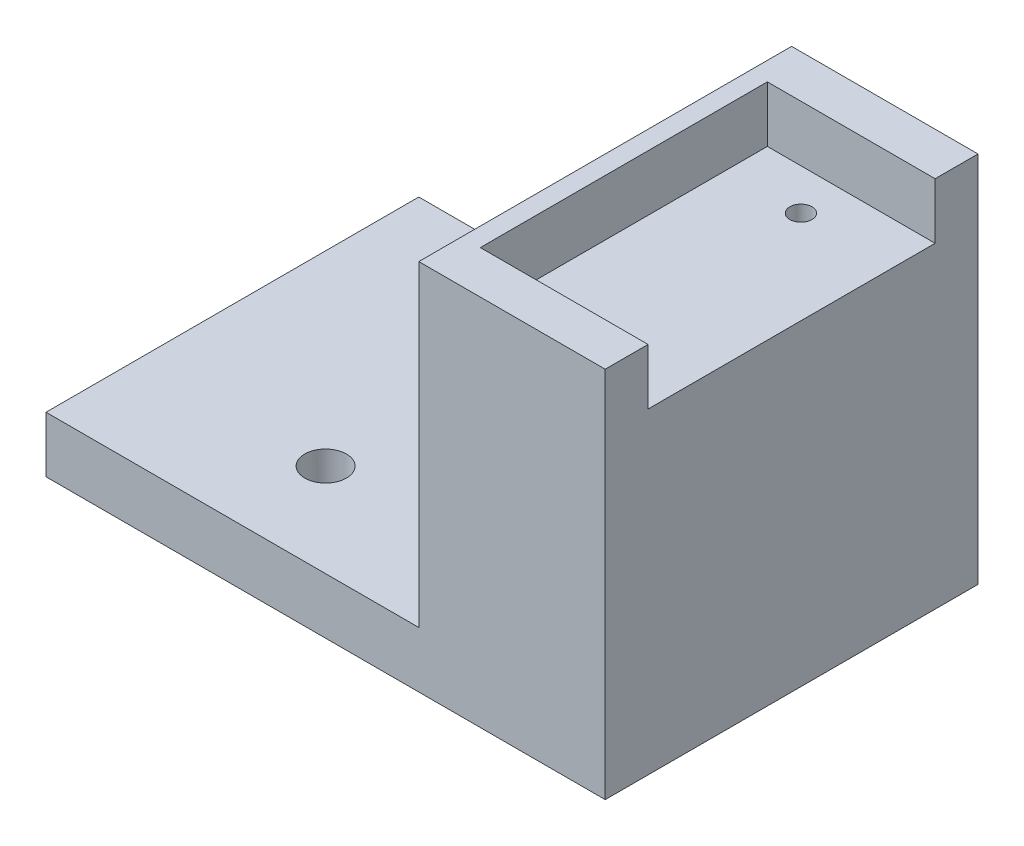
ISO-10303-21;
HEADER;
FILE_DESCRIPTION(('STEP AP214'),'2;1');
FILE_NAME('part.step','',(''),(''),'','','');
FILE_SCHEMA(('AUTOMOTIVE_DESIGN { 1 0 10303 214 1 1 1 1 }'));
ENDSEC;
DATA;
#1=APPLICATION_CONTEXT('core data for automotive mechanical design processes');
#2=APPLICATION_PROTOCOL_DEFINITION('international standard','automotive_design',2000,#1);
#3=PRODUCT_CONTEXT('',#1,'mechanical');
#4=PRODUCT('Part','Part','',(#3));
#5=PRODUCT_RELATED_PRODUCT_CATEGORY('part','',(#4));
#6=PRODUCT_DEFINITION_FORMATION('','',#4);
#7=PRODUCT_DEFINITION_CONTEXT('part definition',#1,'design');
#8=PRODUCT_DEFINITION('design','',#6,#7);
#9=PRODUCT_DEFINITION_SHAPE('','',#8);
#10=(LENGTH_UNIT() NAMED_UNIT(*) SI_UNIT(.MILLI.,.METRE.));
#11=(NAMED_UNIT(*) PLANE_ANGLE_UNIT() SI_UNIT($,.RADIAN.));
#12=(NAMED_UNIT(*) SI_UNIT($,.STERADIAN.) SOLID_ANGLE_UNIT());
#13=UNCERTAINTY_MEASURE_WITH_UNIT(LENGTH_MEASURE(1.E-05),#10,'distance_accuracy_value','');
#14=(GEOMETRIC_REPRESENTATION_CONTEXT(3) GLOBAL_UNCERTAINTY_ASSIGNED_CONTEXT((#13)) GLOBAL_UNIT_ASSIGNED_CONTEXT((#10,
#11,#12)) REPRESENTATION_CONTEXT('',''));
#15=CARTESIAN_POINT('',(0.,0.,0.));
#16=DIRECTION('',(0.,0.,1.));
#17=DIRECTION('',(1.,0.,0.));
#18=AXIS2_PLACEMENT_3D('',#15,#16,#17);
#19=CARTESIAN_POINT('',(12.7,0.,0.));
#20=DIRECTION('',(0.,1.,0.));
#21=DIRECTION('',(0.,0.,1.));
#22=AXIS2_PLACEMENT_3D('',#19,#20,#21);
#23=PLANE('',#22);
#24=CARTESIAN_POINT('',(-12.7,0.,-6.35));
#25=DIRECTION('',(0.,-1.,0.));
#26=DIRECTION('',(0.,0.,-1.));
#27=AXIS2_PLACEMENT_3D('',#24,#25,#26);
#28=CIRCLE('',#27,1.4224);
#29=CARTESIAN_POINT('',(-12.7,0.,-7.7724));
#30=VERTEX_POINT('',#29);
#31=EDGE_CURVE('E412',#30,#30,#28,.T.);
#32=ORIENTED_EDGE('',*,*,#31,.F.);
#33=EDGE_LOOP('',(#32));
#34=FACE_BOUND('',#33,.T.);
#35=CARTESIAN_POINT('',(-12.7,0.,-19.05));
#36=DIRECTION('',(0.,-1.,0.));
#37=DIRECTION('',(0.,0.,-1.));
#38=AXIS2_PLACEMENT_3D('',#35,#36,#37);
#39=CIRCLE('',#38,1.4224);
#40=CARTESIAN_POINT('',(-12.7,0.,-20.4724));
#41=VERTEX_POINT('',#40);
#42=EDGE_CURVE('E417',#41,#41,#39,.T.);
#43=ORIENTED_EDGE('',*,*,#42,.F.);
#44=EDGE_LOOP('',(#43));
#45=FACE_BOUND('',#44,.T.);
#46=DIRECTION('',(-1.,0.,0.));
#47=VECTOR('',#46,1.);
#48=CARTESIAN_POINT('',(12.7,0.,0.));
#49=LINE('',#48,#47);
#50=CARTESIAN_POINT('',(12.7,0.,0.));
#51=VERTEX_POINT('',#50);
#52=CARTESIAN_POINT('',(-25.4,0.,0.));
#53=VERTEX_POINT('',#52);
#54=EDGE_CURVE('E286',#51,#53,#49,.T.);
#55=ORIENTED_EDGE('',*,*,#54,.T.);
#56=DIRECTION('',(0.,0.,-1.));
#57=VECTOR('',#56,1.);
#58=CARTESIAN_POINT('',(-25.4,0.,0.));
#59=LINE('',#58,#57);
#60=CARTESIAN_POINT('',(-25.4,0.,-25.4));
#61=VERTEX_POINT('',#60);
#62=EDGE_CURVE('E177',#53,#61,#59,.T.);
#63=ORIENTED_EDGE('',*,*,#62,.T.);
#64=DIRECTION('',(-1.,0.,0.));
#65=VECTOR('',#64,1.);
#66=CARTESIAN_POINT('',(12.7,0.,-25.4));
#67=LINE('',#66,#65);
#68=CARTESIAN_POINT('',(12.7,0.,-25.4));
#69=VERTEX_POINT('',#68);
#70=EDGE_CURVE('E284',#69,#61,#67,.T.);
#71=ORIENTED_EDGE('',*,*,#70,.F.);
#72=DIRECTION('',(0.,0.,-1.));
#73=VECTOR('',#72,1.);
#74=CARTESIAN_POINT('',(12.7,0.,0.));
#75=LINE('',#74,#73);
#76=EDGE_CURVE('E266',#51,#69,#75,.T.);
#77=ORIENTED_EDGE('',*,*,#76,.F.);
#78=EDGE_LOOP('',(#55,#63,#71,#77));
#79=FACE_BOUND('',#78,.T.);
#80=ADVANCED_FACE('F39',(#34,#45,#79),#23,.F.);
#81=CARTESIAN_POINT('',(12.7,0.,0.));
#82=DIRECTION('',(0.,0.,-1.));
#83=DIRECTION('',(-1.,0.,0.));
#84=AXIS2_PLACEMENT_3D('',#81,#82,#83);
#85=PLANE('',#84);
#86=DIRECTION('',(0.,-1.,0.));
#87=VECTOR('',#86,1.);
#88=CARTESIAN_POINT('',(0.,0.,0.));
#89=LINE('',#88,#87);
#90=CARTESIAN_POINT('',(0.,25.4,0.));
#91=VERTEX_POINT('',#90);
#92=CARTESIAN_POINT('',(0.,3.81,0.));
#93=VERTEX_POINT('',#92);
#94=EDGE_CURVE('E172',#91,#93,#89,.T.);
#95=ORIENTED_EDGE('',*,*,#94,.T.);
#96=DIRECTION('',(-1.,0.,0.));
#97=VECTOR('',#96,1.);
#98=CARTESIAN_POINT('',(12.7,3.81,0.));
#99=LINE('',#98,#97);
#100=CARTESIAN_POINT('',(-25.4,3.81,0.));
#101=VERTEX_POINT('',#100);
#102=EDGE_CURVE('E165',#93,#101,#99,.T.);
#103=ORIENTED_EDGE('',*,*,#102,.T.);
#104=DIRECTION('',(0.,-1.,0.));
#105=VECTOR('',#104,1.);
#106=CARTESIAN_POINT('',(-25.4,3.81,0.));
#107=LINE('',#106,#105);
#108=EDGE_CURVE('E168',#101,#53,#107,.T.);
#109=ORIENTED_EDGE('',*,*,#108,.T.);
#110=ORIENTED_EDGE('',*,*,#54,.F.);
#111=DIRECTION('',(0.,-1.,0.));
#112=VECTOR('',#111,1.);
#113=CARTESIAN_POINT('',(12.7,0.,0.));
#114=LINE('',#113,#112);
#115=CARTESIAN_POINT('',(12.7,25.4,0.));
#116=VERTEX_POINT('',#115);
#117=EDGE_CURVE('E264',#116,#51,#114,.T.);
#118=ORIENTED_EDGE('',*,*,#117,.F.);
#119=DIRECTION('',(-1.,0.,0.));
#120=VECTOR('',#119,1.);
#121=CARTESIAN_POINT('',(12.7,25.4,0.));
#122=LINE('',#121,#120);
#123=EDGE_CURVE('E275',#116,#91,#122,.T.);
#124=ORIENTED_EDGE('',*,*,#123,.T.);
#125=EDGE_LOOP('',(#95,#103,#109,#110,#118,#124));
#126=FACE_BOUND('',#125,.T.);
#127=ADVANCED_FACE('F41',(#126),#85,.F.);
#128=CARTESIAN_POINT('',(12.7,0.,-25.4));
#129=DIRECTION('',(0.,0.,1.));
#130=DIRECTION('',(1.,0.,0.));
#131=AXIS2_PLACEMENT_3D('',#128,#129,#130);
#132=PLANE('',#131);
#133=DIRECTION('',(-1.,0.,0.));
#134=VECTOR('',#133,1.);
#135=CARTESIAN_POINT('',(12.7,25.4,-25.4));
#136=LINE('',#135,#134);
#137=CARTESIAN_POINT('',(12.7,25.4,-25.4));
#138=VERTEX_POINT('',#137);
#139=CARTESIAN_POINT('',(0.,25.4,-25.4));
#140=VERTEX_POINT('',#139);
#141=EDGE_CURVE('E281',#138,#140,#136,.T.);
#142=ORIENTED_EDGE('',*,*,#141,.F.);
#143=DIRECTION('',(0.,1.,0.));
#144=VECTOR('',#143,1.);
#145=CARTESIAN_POINT('',(12.7,0.,-25.4));
#146=LINE('',#145,#144);
#147=EDGE_CURVE('E269',#69,#138,#146,.T.);
#148=ORIENTED_EDGE('',*,*,#147,.F.);
#149=ORIENTED_EDGE('',*,*,#70,.T.);
#150=DIRECTION('',(0.,-1.,0.));
#151=VECTOR('',#150,1.);
#152=CARTESIAN_POINT('',(-25.4,3.81,-25.4));
#153=LINE('',#152,#151);
#154=CARTESIAN_POINT('',(-25.4,3.81,-25.4));
#155=VERTEX_POINT('',#154);
#156=EDGE_CURVE('E185',#155,#61,#153,.T.);
#157=ORIENTED_EDGE('',*,*,#156,.F.);
#158=DIRECTION('',(1.,0.,0.));
#159=VECTOR('',#158,1.);
#160=CARTESIAN_POINT('',(12.7,3.81,-25.4));
#161=LINE('',#160,#159);
#162=CARTESIAN_POINT('',(0.,3.81,-25.4));
#163=VERTEX_POINT('',#162);
#164=EDGE_CURVE('E186',#155,#163,#161,.T.);
#165=ORIENTED_EDGE('',*,*,#164,.T.);
#166=DIRECTION('',(0.,1.,0.));
#167=VECTOR('',#166,1.);
#168=CARTESIAN_POINT('',(0.,0.,-25.4));
#169=LINE('',#168,#167);
#170=EDGE_CURVE('E277',#163,#140,#169,.T.);
#171=ORIENTED_EDGE('',*,*,#170,.T.);
#172=EDGE_LOOP('',(#142,#148,#149,#157,#165,#171));
#173=FACE_BOUND('',#172,.T.);
#174=ADVANCED_FACE('F347',(#173),#132,.F.);
#175=CARTESIAN_POINT('',(12.7,25.4,0.));
#176=DIRECTION('',(0.,-1.,0.));
#177=DIRECTION('',(0.,0.,-1.));
#178=AXIS2_PLACEMENT_3D('',#175,#176,#177);
#179=PLANE('',#178);
#180=DIRECTION('',(0.,0.,1.));
#181=VECTOR('',#180,1.);
#182=CARTESIAN_POINT('',(12.7,25.4,0.));
#183=LINE('',#182,#181);
#184=CARTESIAN_POINT('',(12.7,25.4,-2.921));
#185=VERTEX_POINT('',#184);
#186=EDGE_CURVE('E271',#185,#116,#183,.T.);
#187=ORIENTED_EDGE('',*,*,#186,.F.);
#188=DIRECTION('',(1.,0.,0.));
#189=VECTOR('',#188,1.);
#190=CARTESIAN_POINT('',(12.7,25.4,-2.921));
#191=LINE('',#190,#189);
#192=CARTESIAN_POINT('',(1.27,25.4,-2.921));
#193=VERTEX_POINT('',#192);
#194=EDGE_CURVE('E241',#193,#185,#191,.T.);
#195=ORIENTED_EDGE('',*,*,#194,.F.);
#196=DIRECTION('',(0.,0.,1.));
#197=VECTOR('',#196,1.);
#198=CARTESIAN_POINT('',(1.27,25.4,-2.921));
#199=LINE('',#198,#197);
#200=CARTESIAN_POINT('',(1.27,25.4,-22.479));
#201=VERTEX_POINT('',#200);
#202=EDGE_CURVE('E252',#201,#193,#199,.T.);
#203=ORIENTED_EDGE('',*,*,#202,.F.);
#204=DIRECTION('',(-1.,0.,0.));
#205=VECTOR('',#204,1.);
#206=CARTESIAN_POINT('',(12.7,25.4,-22.479));
#207=LINE('',#206,#205);
#208=CARTESIAN_POINT('',(12.7,25.4,-22.479));
#209=VERTEX_POINT('',#208);
#210=EDGE_CURVE('E236',#209,#201,#207,.T.);
#211=ORIENTED_EDGE('',*,*,#210,.F.);
#212=EDGE_CURVE('E272',#138,#209,#183,.T.);
#213=ORIENTED_EDGE('',*,*,#212,.F.);
#214=ORIENTED_EDGE('',*,*,#141,.T.);
#215=DIRECTION('',(0.,0.,1.));
#216=VECTOR('',#215,1.);
#217=CARTESIAN_POINT('',(0.,25.4,0.));
#218=LINE('',#217,#216);
#219=EDGE_CURVE('E267',#140,#91,#218,.T.);
#220=ORIENTED_EDGE('',*,*,#219,.T.);
#221=ORIENTED_EDGE('',*,*,#123,.F.);
#222=EDGE_LOOP('',(#187,#195,#203,#211,#213,#214,#220,#221));
#223=FACE_BOUND('',#222,.T.);
#224=ADVANCED_FACE('F353',(#223),#179,.F.);
#225=CARTESIAN_POINT('',(12.7,0.,0.));
#226=DIRECTION('',(-1.,0.,0.));
#227=DIRECTION('',(0.,0.,1.));
#228=AXIS2_PLACEMENT_3D('',#225,#226,#227);
#229=PLANE('',#228);
#230=ORIENTED_EDGE('',*,*,#117,.T.);
#231=ORIENTED_EDGE('',*,*,#76,.T.);
#232=ORIENTED_EDGE('',*,*,#147,.T.);
#233=ORIENTED_EDGE('',*,*,#212,.T.);
#234=DIRECTION('',(0.,1.,0.));
#235=VECTOR('',#234,1.);
#236=CARTESIAN_POINT('',(12.7,21.59,-22.479));
#237=LINE('',#236,#235);
#238=CARTESIAN_POINT('',(12.7,21.59,-22.479));
#239=VERTEX_POINT('',#238);
#240=EDGE_CURVE('E249',#239,#209,#237,.T.);
#241=ORIENTED_EDGE('',*,*,#240,.F.);
#242=DIRECTION('',(0.,0.,-1.));
#243=VECTOR('',#242,1.);
#244=CARTESIAN_POINT('',(12.7,21.59,-2.921));
#245=LINE('',#244,#243);
#246=CARTESIAN_POINT('',(12.7,21.59,-2.921));
#247=VERTEX_POINT('',#246);
#248=EDGE_CURVE('E237',#247,#239,#245,.T.);
#249=ORIENTED_EDGE('',*,*,#248,.F.);
#250=DIRECTION('',(0.,1.,0.));
#251=VECTOR('',#250,1.);
#252=CARTESIAN_POINT('',(12.7,21.59,-2.921));
#253=LINE('',#252,#251);
#254=EDGE_CURVE('E256',#247,#185,#253,.T.);
#255=ORIENTED_EDGE('',*,*,#254,.T.);
#256=ORIENTED_EDGE('',*,*,#186,.T.);
#257=EDGE_LOOP('',(#230,#231,#232,#233,#241,#249,#255,#256));
#258=FACE_BOUND('',#257,.T.);
#259=ADVANCED_FACE('F357',(#258),#229,.F.);
#260=CARTESIAN_POINT('',(0.,0.,0.));
#261=DIRECTION('',(-1.,0.,0.));
#262=DIRECTION('',(0.,0.,1.));
#263=AXIS2_PLACEMENT_3D('',#260,#261,#262);
#264=PLANE('',#263);
#265=DIRECTION('',(0.,0.,-1.));
#266=VECTOR('',#265,1.);
#267=CARTESIAN_POINT('',(0.,3.81,0.));
#268=LINE('',#267,#266);
#269=EDGE_CURVE('E201',#93,#163,#268,.T.);
#270=ORIENTED_EDGE('',*,*,#269,.F.);
#271=ORIENTED_EDGE('',*,*,#94,.F.);
#272=ORIENTED_EDGE('',*,*,#219,.F.);
#273=ORIENTED_EDGE('',*,*,#170,.F.);
#274=EDGE_LOOP('',(#270,#271,#272,#273));
#275=FACE_BOUND('',#274,.T.);
#276=ADVANCED_FACE('F359',(#275),#264,.T.);
#277=CARTESIAN_POINT('',(12.7,21.59,-2.921));
#278=DIRECTION('',(0.,0.,1.));
#279=DIRECTION('',(1.,0.,0.));
#280=AXIS2_PLACEMENT_3D('',#277,#278,#279);
#281=PLANE('',#280);
#282=ORIENTED_EDGE('',*,*,#194,.T.);
#283=ORIENTED_EDGE('',*,*,#254,.F.);
#284=DIRECTION('',(1.,0.,0.));
#285=VECTOR('',#284,1.);
#286=CARTESIAN_POINT('',(12.7,21.59,-2.921));
#287=LINE('',#286,#285);
#288=CARTESIAN_POINT('',(1.27,21.59,-2.921));
#289=VERTEX_POINT('',#288);
#290=EDGE_CURVE('E247',#289,#247,#287,.T.);
#291=ORIENTED_EDGE('',*,*,#290,.F.);
#292=DIRECTION('',(0.,1.,0.));
#293=VECTOR('',#292,1.);
#294=CARTESIAN_POINT('',(1.27,21.59,-2.921));
#295=LINE('',#294,#293);
#296=EDGE_CURVE('E259',#289,#193,#295,.T.);
#297=ORIENTED_EDGE('',*,*,#296,.T.);
#298=EDGE_LOOP('',(#282,#283,#291,#297));
#299=FACE_BOUND('',#298,.T.);
#300=ADVANCED_FACE('F362',(#299),#281,.F.);
#301=CARTESIAN_POINT('',(1.27,21.59,-2.921));
#302=DIRECTION('',(-1.,0.,0.));
#303=DIRECTION('',(0.,0.,1.));
#304=AXIS2_PLACEMENT_3D('',#301,#302,#303);
#305=PLANE('',#304);
#306=ORIENTED_EDGE('',*,*,#202,.T.);
#307=ORIENTED_EDGE('',*,*,#296,.F.);
#308=DIRECTION('',(0.,0.,1.));
#309=VECTOR('',#308,1.);
#310=CARTESIAN_POINT('',(1.27,21.59,-2.921));
#311=LINE('',#310,#309);
#312=CARTESIAN_POINT('',(1.27,21.59,-22.479));
#313=VERTEX_POINT('',#312);
#314=EDGE_CURVE('E244',#313,#289,#311,.T.);
#315=ORIENTED_EDGE('',*,*,#314,.F.);
#316=DIRECTION('',(0.,1.,0.));
#317=VECTOR('',#316,1.);
#318=CARTESIAN_POINT('',(1.27,21.59,-22.479));
#319=LINE('',#318,#317);
#320=EDGE_CURVE('E261',#313,#201,#319,.T.);
#321=ORIENTED_EDGE('',*,*,#320,.T.);
#322=EDGE_LOOP('',(#306,#307,#315,#321));
#323=FACE_BOUND('',#322,.T.);
#324=ADVANCED_FACE('F370',(#323),#305,.F.);
#325=CARTESIAN_POINT('',(12.7,21.59,-22.479));
#326=DIRECTION('',(0.,0.,-1.));
#327=DIRECTION('',(-1.,0.,0.));
#328=AXIS2_PLACEMENT_3D('',#325,#326,#327);
#329=PLANE('',#328);
#330=ORIENTED_EDGE('',*,*,#210,.T.);
#331=ORIENTED_EDGE('',*,*,#320,.F.);
#332=DIRECTION('',(-1.,0.,0.));
#333=VECTOR('',#332,1.);
#334=CARTESIAN_POINT('',(12.7,21.59,-22.479));
#335=LINE('',#334,#333);
#336=EDGE_CURVE('E240',#239,#313,#335,.T.);
#337=ORIENTED_EDGE('',*,*,#336,.F.);
#338=ORIENTED_EDGE('',*,*,#240,.T.);
#339=EDGE_LOOP('',(#330,#331,#337,#338));
#340=FACE_BOUND('',#339,.T.);
#341=ADVANCED_FACE('F367',(#340),#329,.F.);
#342=CARTESIAN_POINT('',(0.,21.59,0.));
#343=DIRECTION('',(0.,1.,0.));
#344=DIRECTION('',(0.,0.,1.));
#345=AXIS2_PLACEMENT_3D('',#342,#343,#344);
#346=PLANE('',#345);
#347=CARTESIAN_POINT('',(6.35,21.59,-19.685));
#348=DIRECTION('',(0.,1.,0.));
#349=DIRECTION('',(0.,0.,1.));
#350=AXIS2_PLACEMENT_3D('',#347,#348,#349);
#351=CIRCLE('',#350,0.755649999999999);
#352=CARTESIAN_POINT('',(6.35,21.59,-18.92935));
#353=VERTEX_POINT('',#352);
#354=EDGE_CURVE('E203',#353,#353,#351,.T.);
#355=ORIENTED_EDGE('',*,*,#354,.F.);
#356=EDGE_LOOP('',(#355));
#357=FACE_BOUND('',#356,.T.);
#358=CARTESIAN_POINT('',(6.35,21.59,-5.715));
#359=DIRECTION('',(0.,1.,0.));
#360=DIRECTION('',(0.,0.,1.));
#361=AXIS2_PLACEMENT_3D('',#358,#359,#360);
#362=CIRCLE('',#361,0.755649999999999);
#363=CARTESIAN_POINT('',(6.35,21.59,-4.95935));
#364=VERTEX_POINT('',#363);
#365=EDGE_CURVE('E207',#364,#364,#362,.T.);
#366=ORIENTED_EDGE('',*,*,#365,.F.);
#367=EDGE_LOOP('',(#366));
#368=FACE_BOUND('',#367,.T.);
#369=ORIENTED_EDGE('',*,*,#248,.T.);
#370=ORIENTED_EDGE('',*,*,#336,.T.);
#371=ORIENTED_EDGE('',*,*,#314,.T.);
#372=ORIENTED_EDGE('',*,*,#290,.T.);
#373=EDGE_LOOP('',(#369,#370,#371,#372));
#374=FACE_BOUND('',#373,.T.);
#375=ADVANCED_FACE('F306',(#357,#368,#374),#346,.T.);
#376=CARTESIAN_POINT('',(12.7,0.,-5.08));
#377=DIRECTION('',(0.,0.,-1.));
#378=DIRECTION('',(-1.,0.,0.));
#379=AXIS2_PLACEMENT_3D('',#376,#377,#378);
#380=PLANE('',#379);
#381=DIRECTION('',(1.,0.,0.));
#382=VECTOR('',#381,1.);
#383=CARTESIAN_POINT('',(12.7,3.81,-5.08));
#384=LINE('',#383,#382);
#385=CARTESIAN_POINT('',(5.08,3.81,-5.08));
#386=VERTEX_POINT('',#385);
#387=CARTESIAN_POINT('',(7.62,3.81,-5.08));
#388=VERTEX_POINT('',#387);
#389=EDGE_CURVE('E197',#386,#388,#384,.T.);
#390=ORIENTED_EDGE('',*,*,#389,.F.);
#391=DIRECTION('',(0.,-1.,0.));
#392=VECTOR('',#391,1.);
#393=CARTESIAN_POINT('',(5.08,0.,-5.08));
#394=LINE('',#393,#392);
#395=CARTESIAN_POINT('',(5.08,16.51,-5.08));
#396=VERTEX_POINT('',#395);
#397=EDGE_CURVE('E213',#396,#386,#394,.T.);
#398=ORIENTED_EDGE('',*,*,#397,.F.);
#399=DIRECTION('',(1.,0.,0.));
#400=VECTOR('',#399,1.);
#401=CARTESIAN_POINT('',(12.7,16.51,-5.08));
#402=LINE('',#401,#400);
#403=CARTESIAN_POINT('',(5.9403880830591,16.51,-5.08));
#404=VERTEX_POINT('',#403);
#405=EDGE_CURVE('E226',#396,#404,#402,.T.);
#406=ORIENTED_EDGE('',*,*,#405,.T.);
#407=DIRECTION('',(0.,1.,0.));
#408=VECTOR('',#407,1.);
#409=CARTESIAN_POINT('',(5.9403880830591,21.59,-5.08));
#410=LINE('',#409,#408);
#411=CARTESIAN_POINT('',(5.9403880830591,15.24,-5.08));
#412=VERTEX_POINT('',#411);
#413=EDGE_CURVE('E471',#412,#404,#410,.T.);
#414=ORIENTED_EDGE('',*,*,#413,.F.);
#415=CARTESIAN_POINT('',(2.52900099070995,17.1133355892462,-5.08));
#416=CARTESIAN_POINT('',(2.64201540322495,17.0463521062761,-5.08));
#417=CARTESIAN_POINT('',(2.75506175784389,16.9794224210887,-5.08));
#418=CARTESIAN_POINT('',(2.9813162875857,16.84567898992,-5.08));
#419=CARTESIAN_POINT('',(3.09452451938719,16.778865339838,-5.08));
#420=CARTESIAN_POINT('',(3.32240417419322,16.6446542316648,-5.08));
#421=CARTESIAN_POINT('',(3.4370770464124,16.5772592315379,-5.08));
#422=CARTESIAN_POINT('',(3.66652918173279,16.4428108633368,-5.08));
#423=CARTESIAN_POINT('',(3.78130833790648,16.3757573126209,-5.08));
#424=CARTESIAN_POINT('',(4.0617638217865,16.2126051310175,-5.08));
#425=CARTESIAN_POINT('',(4.22757249043334,16.1167328484863,-5.08));
#426=CARTESIAN_POINT('',(4.4771903357659,15.9740844223649,-5.08));
#427=CARTESIAN_POINT('',(4.56063854726971,15.9266772398798,-5.08));
#428=CARTESIAN_POINT('',(4.72787342543712,15.8325027331809,-5.08));
#429=CARTESIAN_POINT('',(4.81166001753413,15.7857352770013,-5.08));
#430=CARTESIAN_POINT('',(4.97898528272154,15.6935966481621,-5.08));
#431=CARTESIAN_POINT('',(5.06251902936615,15.6482165408616,-5.08));
#432=CARTESIAN_POINT('',(5.23047738056954,15.5589454197271,-5.08));
#433=CARTESIAN_POINT('',(5.3149026625514,15.5150556638708,-5.08));
#434=CARTESIAN_POINT('',(5.44240879881117,15.4513715784984,-5.08));
#435=CARTESIAN_POINT('',(5.48497039437972,15.4305411193031,-5.08));
#436=CARTESIAN_POINT('',(5.5705489647039,15.3898411783692,-5.08));
#437=CARTESIAN_POINT('',(5.61356589494785,15.3699716037368,-5.08));
#438=CARTESIAN_POINT('',(5.70014503438768,15.3316132289932,-5.08));
#439=CARTESIAN_POINT('',(5.74370642541342,15.3131225937379,-5.08));
#440=CARTESIAN_POINT('',(5.8316062676533,15.2781053102797,-5.08));
#441=CARTESIAN_POINT('',(5.87594433198906,15.2615777144685,-5.08));
#442=CARTESIAN_POINT('',(5.93751046696318,15.240863993883,-5.08));
#443=CARTESIAN_POINT('',(5.95432008047677,15.2354330790399,-5.08));
#444=CARTESIAN_POINT('',(5.98808611835203,15.225038732737,-5.08));
#445=CARTESIAN_POINT('',(6.00504256772748,15.2200753827092,-5.08));
#446=CARTESIAN_POINT('',(6.05612350287535,15.2059922603187,-5.08));
#447=CARTESIAN_POINT('',(6.09047647971273,15.1976735896187,-5.08));
#448=CARTESIAN_POINT('',(6.1587948913522,15.1839721205714,-5.08));
#449=CARTESIAN_POINT('',(6.19274508243989,15.178515006145,-5.08));
#450=CARTESIAN_POINT('',(6.26101744532734,15.1707082770876,-5.08));
#451=CARTESIAN_POINT('',(6.29533967181176,15.1683591257093,-5.08));
#452=CARTESIAN_POINT('',(6.36796838855446,15.1669681983729,-5.08));
#453=CARTESIAN_POINT('',(6.40628354642983,15.1683334787718,-5.08));
#454=CARTESIAN_POINT('',(6.48254679101915,15.1750677136314,-5.08));
#455=CARTESIAN_POINT('',(6.52049484414716,15.180437030972,-5.08));
#456=CARTESIAN_POINT('',(6.59675635428639,15.1947045148698,-5.08));
#457=CARTESIAN_POINT('',(6.63505221455967,15.2036936574173,-5.08));
#458=CARTESIAN_POINT('',(6.71090681942962,15.2243546765166,-5.08));
#459=CARTESIAN_POINT('',(6.74846531884478,15.2360274295361,-5.08));
#460=CARTESIAN_POINT('',(6.82342733197512,15.2615091838523,-5.08));
#461=CARTESIAN_POINT('',(6.86082128159504,15.2753458539452,-5.08));
#462=CARTESIAN_POINT('',(6.9350389060927,15.3044819530219,-5.08));
#463=CARTESIAN_POINT('',(6.97186243092698,15.3197817595221,-5.08));
#464=CARTESIAN_POINT('',(7.08172173451286,15.3672826600584,-5.08));
#465=CARTESIAN_POINT('',(7.15407199916511,15.401058060547,-5.08));
#466=CARTESIAN_POINT('',(7.29791069502713,15.4710469696377,-5.08));
#467=CARTESIAN_POINT('',(7.36939457219342,15.5072696134998,-5.08));
#468=CARTESIAN_POINT('',(7.51158651902453,15.5811032008754,-5.08));
#469=CARTESIAN_POINT('',(7.58229501917537,15.6187133175587,-5.08));
#470=CARTESIAN_POINT('',(7.71392939880741,15.6898140690426,-5.08));
#471=CARTESIAN_POINT('',(7.77491555826375,15.7231938101108,-5.08));
#472=CARTESIAN_POINT('',(7.89663057332101,15.7904432713706,-5.08));
#473=CARTESIAN_POINT('',(7.95735938304031,15.8243130745435,-5.08));
#474=CARTESIAN_POINT('',(8.0781416589525,15.8921372660413,-5.08));
#475=CARTESIAN_POINT('',(8.13819667934129,15.9260888922045,-5.08));
#476=CARTESIAN_POINT('',(8.25814315108779,15.9942523596503,-5.08));
#477=CARTESIAN_POINT('',(8.31803463258313,16.0284641478729,-5.08));
#478=CARTESIAN_POINT('',(8.37787208769401,16.0627694312105,-5.08));
#479=B_SPLINE_CURVE_WITH_KNOTS('',3,(#415,#416,#417,#418,#419,#420,#421,#422,#423,#424,#425,
#426,#427,#428,#429,#430,#431,#432,#433,#434,#435,#436,#437,#438,#439,#440,#441,#442,#443,#444,
#445,#446,#447,#448,#449,#450,#451,#452,#453,#454,#455,#456,#457,#458,#459,#460,#461,#462,#463,
#464,#465,#466,#467,#468,#469,#470,#471,#472,#473,#474,#475,#476,#477,#478),.UNSPECIFIED.,.F.,
.F.,(4,2,2,2,2,2,2,2,2,2,2,2,2,2,2,2,2,2,2,2,2,2,2,2,2,2,2,2,2,2,2,4),(0.,0.394121090151471,
0.788483136322856,1.18751598493854,1.58630646279501,2.16089178893369,2.44881282253906,
2.73667353848042,3.02186036117163,3.3072822056617,3.44943114182622,3.59156630811281,
3.73350880887791,3.87538250954579,3.92837194690166,3.98137059600906,4.08731433694992,
4.19035015628706,4.29340133174014,4.40818655661444,4.52298218556662,4.64086352243222,
4.758783414191,4.87835739006291,4.99796230190651,5.23740887305896,5.47780475630461,
5.71805962509255,5.92662788937237,6.13523189332406,6.34219462758687,6.54911622717603),.UNSPECIFIED.);
#480=CARTESIAN_POINT('',(6.75961191694091,15.24,-5.08));
#481=VERTEX_POINT('',#480);
#482=EDGE_CURVE('E288',#481,#412,#479,.F.);
#483=ORIENTED_EDGE('',*,*,#482,.F.);
#484=DIRECTION('',(0.,1.,0.));
#485=VECTOR('',#484,1.);
#486=CARTESIAN_POINT('',(6.75961191694091,21.59,-5.08));
#487=LINE('',#486,#485);
#488=CARTESIAN_POINT('',(6.75961191694091,16.51,-5.08));
#489=VERTEX_POINT('',#488);
#490=EDGE_CURVE('E296',#489,#481,#487,.F.);
#491=ORIENTED_EDGE('',*,*,#490,.F.);
#492=CARTESIAN_POINT('',(7.62,16.51,-5.08));
#493=VERTEX_POINT('',#492);
#494=EDGE_CURVE('E223',#489,#493,#402,.T.);
#495=ORIENTED_EDGE('',*,*,#494,.T.);
#496=DIRECTION('',(0.,-1.,0.));
#497=VECTOR('',#496,1.);
#498=CARTESIAN_POINT('',(7.62,0.,-5.08));
#499=LINE('',#498,#497);
#500=EDGE_CURVE('E217',#493,#388,#499,.T.);
#501=ORIENTED_EDGE('',*,*,#500,.T.);
#502=EDGE_LOOP('',(#390,#398,#406,#414,#483,#491,#495,#501));
#503=FACE_BOUND('',#502,.T.);
#504=ADVANCED_FACE('F301',(#503),#380,.T.);
#505=CARTESIAN_POINT('',(12.7,0.,-20.32));
#506=DIRECTION('',(0.,0.,1.));
#507=DIRECTION('',(1.,0.,0.));
#508=AXIS2_PLACEMENT_3D('',#505,#506,#507);
#509=PLANE('',#508);
#510=DIRECTION('',(-1.,0.,0.));
#511=VECTOR('',#510,1.);
#512=CARTESIAN_POINT('',(12.7,3.81,-20.32));
#513=LINE('',#512,#511);
#514=CARTESIAN_POINT('',(7.62,3.81,-20.32));
#515=VERTEX_POINT('',#514);
#516=CARTESIAN_POINT('',(5.08,3.81,-20.32));
#517=VERTEX_POINT('',#516);
#518=EDGE_CURVE('E56',#515,#517,#513,.T.);
#519=ORIENTED_EDGE('',*,*,#518,.F.);
#520=DIRECTION('',(0.,1.,0.));
#521=VECTOR('',#520,1.);
#522=CARTESIAN_POINT('',(7.62,0.,-20.32));
#523=LINE('',#522,#521);
#524=CARTESIAN_POINT('',(7.62,16.51,-20.32));
#525=VERTEX_POINT('',#524);
#526=EDGE_CURVE('E220',#515,#525,#523,.T.);
#527=ORIENTED_EDGE('',*,*,#526,.T.);
#528=DIRECTION('',(1.,0.,0.));
#529=VECTOR('',#528,1.);
#530=CARTESIAN_POINT('',(0.,16.51,-20.32));
#531=LINE('',#530,#529);
#532=CARTESIAN_POINT('',(6.7596119169409,16.51,-20.32));
#533=VERTEX_POINT('',#532);
#534=EDGE_CURVE('E229',#533,#525,#531,.T.);
#535=ORIENTED_EDGE('',*,*,#534,.F.);
#536=DIRECTION('',(0.,1.,0.));
#537=VECTOR('',#536,1.);
#538=CARTESIAN_POINT('',(6.7596119169409,21.59,-20.32));
#539=LINE('',#538,#537);
#540=CARTESIAN_POINT('',(6.7596119169409,15.24,-20.32));
#541=VERTEX_POINT('',#540);
#542=EDGE_CURVE('E408',#541,#533,#539,.T.);
#543=ORIENTED_EDGE('',*,*,#542,.F.);
#544=CARTESIAN_POINT('',(2.52900099070995,17.1133355892462,-20.32));
#545=CARTESIAN_POINT('',(2.64201540322495,17.0463521062761,-20.32));
#546=CARTESIAN_POINT('',(2.75506175784389,16.9794224210887,-20.32));
#547=CARTESIAN_POINT('',(2.9813162875857,16.84567898992,-20.32));
#548=CARTESIAN_POINT('',(3.0945245193872,16.778865339838,-20.32));
#549=CARTESIAN_POINT('',(3.32240417419323,16.6446542316648,-20.32));
#550=CARTESIAN_POINT('',(3.43707704641241,16.5772592315379,-20.32));
#551=CARTESIAN_POINT('',(3.6665291817328,16.4428108633368,-20.32));
#552=CARTESIAN_POINT('',(3.78130833790649,16.3757573126209,-20.32));
#553=CARTESIAN_POINT('',(4.06176382178651,16.2126051310175,-20.32));
#554=CARTESIAN_POINT('',(4.22757249043335,16.1167328484863,-20.32));
#555=CARTESIAN_POINT('',(4.47719033576591,15.9740844223649,-20.32));
#556=CARTESIAN_POINT('',(4.56063854726971,15.9266772398798,-20.32));
#557=CARTESIAN_POINT('',(4.72787342543712,15.8325027331809,-20.32));
#558=CARTESIAN_POINT('',(4.81166001753413,15.7857352770012,-20.32));
#559=CARTESIAN_POINT('',(4.97898528272155,15.6935966481621,-20.32));
#560=CARTESIAN_POINT('',(5.06251902936616,15.6482165408616,-20.32));
#561=CARTESIAN_POINT('',(5.23047738056955,15.5589454197271,-20.32));
#562=CARTESIAN_POINT('',(5.31490266255141,15.5150556638708,-20.32));
#563=CARTESIAN_POINT('',(5.44240879881117,15.4513715784984,-20.32));
#564=CARTESIAN_POINT('',(5.48497039437972,15.4305411193031,-20.32));
#565=CARTESIAN_POINT('',(5.5705489647039,15.3898411783692,-20.32));
#566=CARTESIAN_POINT('',(5.61356589494785,15.3699716037368,-20.32));
#567=CARTESIAN_POINT('',(5.70014503438768,15.3316132289932,-20.32));
#568=CARTESIAN_POINT('',(5.74370642541342,15.3131225937379,-20.32));
#569=CARTESIAN_POINT('',(5.83160626765331,15.2781053102797,-20.32));
#570=CARTESIAN_POINT('',(5.87594433198906,15.2615777144685,-20.32));
#571=CARTESIAN_POINT('',(5.93751046696318,15.240863993883,-20.32));
#572=CARTESIAN_POINT('',(5.95432008047677,15.2354330790399,-20.32));
#573=CARTESIAN_POINT('',(5.98808611835203,15.225038732737,-20.32));
#574=CARTESIAN_POINT('',(6.00504256772748,15.2200753827092,-20.32));
#575=CARTESIAN_POINT('',(6.05612350287535,15.2059922603187,-20.32));
#576=CARTESIAN_POINT('',(6.09047647971273,15.1976735896187,-20.32));
#577=CARTESIAN_POINT('',(6.1587948913522,15.1839721205714,-20.32));
#578=CARTESIAN_POINT('',(6.19274508243989,15.178515006145,-20.32));
#579=CARTESIAN_POINT('',(6.26101744532734,15.1707082770876,-20.32));
#580=CARTESIAN_POINT('',(6.29533967181177,15.1683591257093,-20.32));
#581=CARTESIAN_POINT('',(6.36796838855447,15.1669681983729,-20.32));
#582=CARTESIAN_POINT('',(6.40628354642984,15.1683334787718,-20.32));
#583=CARTESIAN_POINT('',(6.48254679101915,15.1750677136314,-20.32));
#584=CARTESIAN_POINT('',(6.52049484414716,15.180437030972,-20.32));
#585=CARTESIAN_POINT('',(6.59675635428639,15.1947045148698,-20.32));
#586=CARTESIAN_POINT('',(6.63505221455967,15.2036936574173,-20.32));
#587=CARTESIAN_POINT('',(6.71090681942963,15.2243546765166,-20.32));
#588=CARTESIAN_POINT('',(6.74846531884478,15.2360274295361,-20.32));
#589=CARTESIAN_POINT('',(6.82342733197512,15.2615091838523,-20.32));
#590=CARTESIAN_POINT('',(6.86082128159504,15.2753458539452,-20.32));
#591=CARTESIAN_POINT('',(6.93503890609271,15.3044819530219,-20.32));
#592=CARTESIAN_POINT('',(6.97186243092699,15.3197817595221,-20.32));
#593=CARTESIAN_POINT('',(7.08172173451287,15.3672826600584,-20.32));
#594=CARTESIAN_POINT('',(7.15407199916512,15.401058060547,-20.32));
#595=CARTESIAN_POINT('',(7.29791069502714,15.4710469696377,-20.32));
#596=CARTESIAN_POINT('',(7.36939457219343,15.5072696134998,-20.32));
#597=CARTESIAN_POINT('',(7.51158651902454,15.5811032008754,-20.32));
#598=CARTESIAN_POINT('',(7.58229501917538,15.6187133175587,-20.32));
#599=CARTESIAN_POINT('',(7.71392939880742,15.6898140690426,-20.32));
#600=CARTESIAN_POINT('',(7.77491555826376,15.7231938101108,-20.32));
#601=CARTESIAN_POINT('',(7.89663057332102,15.7904432713706,-20.32));
#602=CARTESIAN_POINT('',(7.95735938304032,15.8243130745435,-20.32));
#603=CARTESIAN_POINT('',(8.07814165895251,15.8921372660413,-20.32));
#604=CARTESIAN_POINT('',(8.13819667934131,15.9260888922045,-20.32));
#605=CARTESIAN_POINT('',(8.25814315108781,15.9942523596503,-20.32));
#606=CARTESIAN_POINT('',(8.31803463258315,16.0284641478729,-20.32));
#607=CARTESIAN_POINT('',(8.37787208769403,16.0627694312105,-20.32));
#608=B_SPLINE_CURVE_WITH_KNOTS('',3,(#544,#545,#546,#547,#548,#549,#550,#551,#552,#553,#554,
#555,#556,#557,#558,#559,#560,#561,#562,#563,#564,#565,#566,#567,#568,#569,#570,#571,#572,#573,
#574,#575,#576,#577,#578,#579,#580,#581,#582,#583,#584,#585,#586,#587,#588,#589,#590,#591,#592,
#593,#594,#595,#596,#597,#598,#599,#600,#601,#602,#603,#604,#605,#606,#607),.UNSPECIFIED.,.F.,
.F.,(4,2,2,2,2,2,2,2,2,2,2,2,2,2,2,2,2,2,2,2,2,2,2,2,2,2,2,2,2,2,2,4),(0.,0.394121090151478,
0.788483136322864,1.18751598493855,1.58630646279502,2.1608917889337,2.44881282253907,
2.73667353848042,3.02186036117164,3.30728220566171,3.44943114182622,3.59156630811281,
3.73350880887791,3.87538250954579,3.92837194690166,3.98137059600906,4.08731433694992,
4.19035015628706,4.29340133174015,4.40818655661444,4.52298218556663,4.64086352243222,
4.758783414191,4.87835739006291,4.99796230190651,5.23740887305897,5.47780475630462,
5.71805962509257,5.92662788937238,6.13523189332408,6.34219462758688,6.54911622717605),.UNSPECIFIED.);
#609=CARTESIAN_POINT('',(5.9403880830591,15.24,-20.32));
#610=VERTEX_POINT('',#609);
#611=EDGE_CURVE('E315',#610,#541,#608,.T.);
#612=ORIENTED_EDGE('',*,*,#611,.F.);
#613=DIRECTION('',(0.,1.,0.));
#614=VECTOR('',#613,1.);
#615=CARTESIAN_POINT('',(5.9403880830591,21.59,-20.32));
#616=LINE('',#615,#614);
#617=CARTESIAN_POINT('',(5.9403880830591,16.51,-20.32));
#618=VERTEX_POINT('',#617);
#619=EDGE_CURVE('E323',#618,#610,#616,.F.);
#620=ORIENTED_EDGE('',*,*,#619,.F.);
#621=CARTESIAN_POINT('',(5.08,16.51,-20.32));
#622=VERTEX_POINT('',#621);
#623=EDGE_CURVE('E230',#622,#618,#531,.T.);
#624=ORIENTED_EDGE('',*,*,#623,.F.);
#625=DIRECTION('',(0.,1.,0.));
#626=VECTOR('',#625,1.);
#627=CARTESIAN_POINT('',(5.08,0.,-20.32));
#628=LINE('',#627,#626);
#629=EDGE_CURVE('E216',#517,#622,#628,.T.);
#630=ORIENTED_EDGE('',*,*,#629,.F.);
#631=EDGE_LOOP('',(#519,#527,#535,#543,#612,#620,#624,#630));
#632=FACE_BOUND('',#631,.T.);
#633=ADVANCED_FACE('F305',(#632),#509,.T.);
#634=CARTESIAN_POINT('',(7.62,0.,0.));
#635=DIRECTION('',(-1.,0.,0.));
#636=DIRECTION('',(0.,0.,1.));
#637=AXIS2_PLACEMENT_3D('',#634,#635,#636);
#638=PLANE('',#637);
#639=DIRECTION('',(0.,0.,-1.));
#640=VECTOR('',#639,1.);
#641=CARTESIAN_POINT('',(7.62,3.81,0.));
#642=LINE('',#641,#640);
#643=EDGE_CURVE('E199',#388,#515,#642,.T.);
#644=ORIENTED_EDGE('',*,*,#643,.F.);
#645=ORIENTED_EDGE('',*,*,#500,.F.);
#646=DIRECTION('',(0.,0.,-1.));
#647=VECTOR('',#646,1.);
#648=CARTESIAN_POINT('',(7.62,16.51,0.));
#649=LINE('',#648,#647);
#650=EDGE_CURVE('E212',#493,#525,#649,.T.);
#651=ORIENTED_EDGE('',*,*,#650,.T.);
#652=ORIENTED_EDGE('',*,*,#526,.F.);
#653=EDGE_LOOP('',(#644,#645,#651,#652));
#654=FACE_BOUND('',#653,.T.);
#655=ADVANCED_FACE('F311',(#654),#638,.T.);
#656=CARTESIAN_POINT('',(5.08,0.,0.));
#657=DIRECTION('',(-1.,0.,0.));
#658=DIRECTION('',(0.,0.,1.));
#659=AXIS2_PLACEMENT_3D('',#656,#657,#658);
#660=PLANE('',#659);
#661=ORIENTED_EDGE('',*,*,#397,.T.);
#662=DIRECTION('',(0.,0.,-1.));
#663=VECTOR('',#662,1.);
#664=CARTESIAN_POINT('',(5.08,3.81,0.));
#665=LINE('',#664,#663);
#666=EDGE_CURVE('E11',#386,#517,#665,.T.);
#667=ORIENTED_EDGE('',*,*,#666,.T.);
#668=ORIENTED_EDGE('',*,*,#629,.T.);
#669=DIRECTION('',(0.,0.,1.));
#670=VECTOR('',#669,1.);
#671=CARTESIAN_POINT('',(5.08,16.51,0.));
#672=LINE('',#671,#670);
#673=EDGE_CURVE('E233',#622,#396,#672,.T.);
#674=ORIENTED_EDGE('',*,*,#673,.T.);
#675=EDGE_LOOP('',(#661,#667,#668,#674));
#676=FACE_BOUND('',#675,.T.);
#677=ADVANCED_FACE('F382',(#676),#660,.F.);
#678=CARTESIAN_POINT('',(0.,16.51,0.));
#679=DIRECTION('',(0.,1.,0.));
#680=DIRECTION('',(0.,0.,1.));
#681=AXIS2_PLACEMENT_3D('',#678,#679,#680);
#682=PLANE('',#681);
#683=ORIENTED_EDGE('',*,*,#623,.T.);
#684=CARTESIAN_POINT('',(6.35,16.51,-19.685));
#685=DIRECTION('',(0.,1.,0.));
#686=DIRECTION('',(0.,0.,1.));
#687=AXIS2_PLACEMENT_3D('',#684,#685,#686);
#688=CIRCLE('',#687,0.755649999999999);
#689=EDGE_CURVE('E48',#618,#533,#688,.T.);
#690=ORIENTED_EDGE('',*,*,#689,.T.);
#691=ORIENTED_EDGE('',*,*,#534,.T.);
#692=ORIENTED_EDGE('',*,*,#650,.F.);
#693=ORIENTED_EDGE('',*,*,#494,.F.);
#694=CARTESIAN_POINT('',(6.35,16.51,-5.715));
#695=DIRECTION('',(0.,1.,0.));
#696=DIRECTION('',(0.,0.,1.));
#697=AXIS2_PLACEMENT_3D('',#694,#695,#696);
#698=CIRCLE('',#697,0.755649999999999);
#699=EDGE_CURVE('E324',#489,#404,#698,.T.);
#700=ORIENTED_EDGE('',*,*,#699,.T.);
#701=ORIENTED_EDGE('',*,*,#405,.F.);
#702=ORIENTED_EDGE('',*,*,#673,.F.);
#703=EDGE_LOOP('',(#683,#690,#691,#692,#693,#700,#701,#702));
#704=FACE_BOUND('',#703,.T.);
#705=ADVANCED_FACE('F338',(#704),#682,.F.);
#706=CARTESIAN_POINT('',(6.35,15.24,-5.715));
#707=DIRECTION('',(0.,1.,0.));
#708=DIRECTION('',(0.,0.,1.));
#709=AXIS2_PLACEMENT_3D('',#706,#707,#708);
#710=CONICAL_SURFACE('',#709,0.755649999999998,1.02974425867665);
#711=ORIENTED_EDGE('',*,*,#482,.T.);
#712=CARTESIAN_POINT('',(6.35,15.24,-5.715));
#713=DIRECTION('',(0.,1.,0.));
#714=DIRECTION('',(0.,0.,1.));
#715=AXIS2_PLACEMENT_3D('',#712,#713,#714);
#716=CIRCLE('',#715,0.755649999999998);
#717=EDGE_CURVE('E210',#412,#481,#716,.T.);
#718=ORIENTED_EDGE('',*,*,#717,.T.);
#719=EDGE_LOOP('',(#711,#718));
#720=FACE_BOUND('',#719,.T.);
#721=ADVANCED_FACE('F298',(#720),#710,.F.);
#722=CARTESIAN_POINT('',(6.35,21.59,-5.715));
#723=DIRECTION('',(0.,1.,0.));
#724=DIRECTION('',(0.,0.,1.));
#725=AXIS2_PLACEMENT_3D('',#722,#723,#724);
#726=CYLINDRICAL_SURFACE('',#725,0.755649999999999);
#727=ORIENTED_EDGE('',*,*,#413,.T.);
#728=ORIENTED_EDGE('',*,*,#699,.F.);
#729=ORIENTED_EDGE('',*,*,#490,.T.);
#730=ORIENTED_EDGE('',*,*,#717,.F.);
#731=EDGE_LOOP('',(#727,#728,#729,#730));
#732=FACE_BOUND('',#731,.T.);
#733=ORIENTED_EDGE('',*,*,#365,.T.);
#734=EDGE_LOOP('',(#733));
#735=FACE_BOUND('',#734,.T.);
#736=ADVANCED_FACE('F331',(#732,#735),#726,.F.);
#737=CARTESIAN_POINT('',(6.35,15.24,-19.685));
#738=DIRECTION('',(0.,1.,0.));
#739=DIRECTION('',(0.,0.,1.));
#740=AXIS2_PLACEMENT_3D('',#737,#738,#739);
#741=CONICAL_SURFACE('',#740,0.755649999999998,1.02974425867665);
#742=ORIENTED_EDGE('',*,*,#611,.T.);
#743=CARTESIAN_POINT('',(6.35,15.24,-19.685));
#744=DIRECTION('',(0.,1.,0.));
#745=DIRECTION('',(0.,0.,1.));
#746=AXIS2_PLACEMENT_3D('',#743,#744,#745);
#747=CIRCLE('',#746,0.755649999999998);
#748=EDGE_CURVE('E62',#541,#610,#747,.T.);
#749=ORIENTED_EDGE('',*,*,#748,.T.);
#750=EDGE_LOOP('',(#742,#749));
#751=FACE_BOUND('',#750,.T.);
#752=ADVANCED_FACE('F326',(#751),#741,.F.);
#753=CARTESIAN_POINT('',(6.35,21.59,-19.685));
#754=DIRECTION('',(0.,1.,0.));
#755=DIRECTION('',(0.,0.,1.));
#756=AXIS2_PLACEMENT_3D('',#753,#754,#755);
#757=CYLINDRICAL_SURFACE('',#756,0.755649999999999);
#758=ORIENTED_EDGE('',*,*,#542,.T.);
#759=ORIENTED_EDGE('',*,*,#689,.F.);
#760=ORIENTED_EDGE('',*,*,#619,.T.);
#761=ORIENTED_EDGE('',*,*,#748,.F.);
#762=EDGE_LOOP('',(#758,#759,#760,#761));
#763=FACE_BOUND('',#762,.T.);
#764=ORIENTED_EDGE('',*,*,#354,.T.);
#765=EDGE_LOOP('',(#764));
#766=FACE_BOUND('',#765,.T.);
#767=ADVANCED_FACE('F330',(#763,#766),#757,.F.);
#768=CARTESIAN_POINT('',(0.,3.81,0.));
#769=DIRECTION('',(0.,1.,0.));
#770=DIRECTION('',(0.,0.,1.));
#771=AXIS2_PLACEMENT_3D('',#768,#769,#770);
#772=PLANE('',#771);
#773=ORIENTED_EDGE('',*,*,#389,.T.);
#774=ORIENTED_EDGE('',*,*,#643,.T.);
#775=ORIENTED_EDGE('',*,*,#518,.T.);
#776=ORIENTED_EDGE('',*,*,#666,.F.);
#777=EDGE_LOOP('',(#773,#774,#775,#776));
#778=FACE_BOUND('',#777,.T.);
#779=ADVANCED_FACE('F397',(#778),#772,.T.);
#780=CARTESIAN_POINT('',(-12.7,3.81,-6.35));
#781=DIRECTION('',(0.,1.,0.));
#782=DIRECTION('',(0.,0.,1.));
#783=AXIS2_PLACEMENT_3D('',#780,#781,#782);
#784=CIRCLE('',#783,1.4224);
#785=CARTESIAN_POINT('',(-12.7,3.81,-4.9276));
#786=VERTEX_POINT('',#785);
#787=EDGE_CURVE('E43',#786,#786,#784,.T.);
#788=ORIENTED_EDGE('',*,*,#787,.F.);
#789=EDGE_LOOP('',(#788));
#790=FACE_BOUND('',#789,.T.);
#791=CARTESIAN_POINT('',(-12.7,3.81,-19.05));
#792=DIRECTION('',(0.,1.,0.));
#793=DIRECTION('',(0.,0.,1.));
#794=AXIS2_PLACEMENT_3D('',#791,#792,#793);
#795=CIRCLE('',#794,1.4224);
#796=CARTESIAN_POINT('',(-12.7,3.81,-17.6276));
#797=VERTEX_POINT('',#796);
#798=EDGE_CURVE('E410',#797,#797,#795,.T.);
#799=ORIENTED_EDGE('',*,*,#798,.F.);
#800=EDGE_LOOP('',(#799));
#801=FACE_BOUND('',#800,.T.);
#802=ORIENTED_EDGE('',*,*,#102,.F.);
#803=ORIENTED_EDGE('',*,*,#269,.T.);
#804=ORIENTED_EDGE('',*,*,#164,.F.);
#805=DIRECTION('',(0.,0.,-1.));
#806=VECTOR('',#805,1.);
#807=CARTESIAN_POINT('',(-25.4,3.81,0.));
#808=LINE('',#807,#806);
#809=EDGE_CURVE('E176',#101,#155,#808,.T.);
#810=ORIENTED_EDGE('',*,*,#809,.F.);
#811=EDGE_LOOP('',(#802,#803,#804,#810));
#812=FACE_BOUND('',#811,.T.);
#813=ADVANCED_FACE('F188',(#790,#801,#812),#772,.T.);
#814=CARTESIAN_POINT('',(-25.4,3.81,0.));
#815=DIRECTION('',(-1.,0.,0.));
#816=DIRECTION('',(0.,0.,1.));
#817=AXIS2_PLACEMENT_3D('',#814,#815,#816);
#818=PLANE('',#817);
#819=ORIENTED_EDGE('',*,*,#62,.F.);
#820=ORIENTED_EDGE('',*,*,#108,.F.);
#821=ORIENTED_EDGE('',*,*,#809,.T.);
#822=ORIENTED_EDGE('',*,*,#156,.T.);
#823=EDGE_LOOP('',(#819,#820,#821,#822));
#824=FACE_BOUND('',#823,.T.);
#825=ADVANCED_FACE('F181',(#824),#818,.T.);
#826=CARTESIAN_POINT('',(-12.7,25.4,-19.05));
#827=DIRECTION('',(0.,-1.,0.));
#828=DIRECTION('',(0.,0.,-1.));
#829=AXIS2_PLACEMENT_3D('',#826,#827,#828);
#830=CYLINDRICAL_SURFACE('',#829,1.4224);
#831=ORIENTED_EDGE('',*,*,#798,.T.);
#832=EDGE_LOOP('',(#831));
#833=FACE_BOUND('',#832,.T.);
#834=ORIENTED_EDGE('',*,*,#42,.T.);
#835=EDGE_LOOP('',(#834));
#836=FACE_BOUND('',#835,.T.);
#837=ADVANCED_FACE('F423',(#833,#836),#830,.F.);
#838=CARTESIAN_POINT('',(-12.7,25.4,-6.35));
#839=DIRECTION('',(0.,-1.,0.));
#840=DIRECTION('',(0.,0.,-1.));
#841=AXIS2_PLACEMENT_3D('',#838,#839,#840);
#842=CYLINDRICAL_SURFACE('',#841,1.4224);
#843=ORIENTED_EDGE('',*,*,#787,.T.);
#844=EDGE_LOOP('',(#843));
#845=FACE_BOUND('',#844,.T.);
#846=ORIENTED_EDGE('',*,*,#31,.T.);
#847=EDGE_LOOP('',(#846));
#848=FACE_BOUND('',#847,.T.);
#849=ADVANCED_FACE('F445',(#845,#848),#842,.F.);
#850=CLOSED_SHELL('',(#80,#127,#174,#224,#259,#276,#300,#324,#341,#375,#504,#633,#655,#677,#705,
#721,#736,#752,#767,#779,#813,#825,#837,#849));
#851=MANIFOLD_SOLID_BREP('B2',#850);
#852=ADVANCED_BREP_SHAPE_REPRESENTATION('',(#18,#851),#14);
#853=SHAPE_DEFINITION_REPRESENTATION(#9,#852);
ENDSEC;
END-ISO-10303-21;
